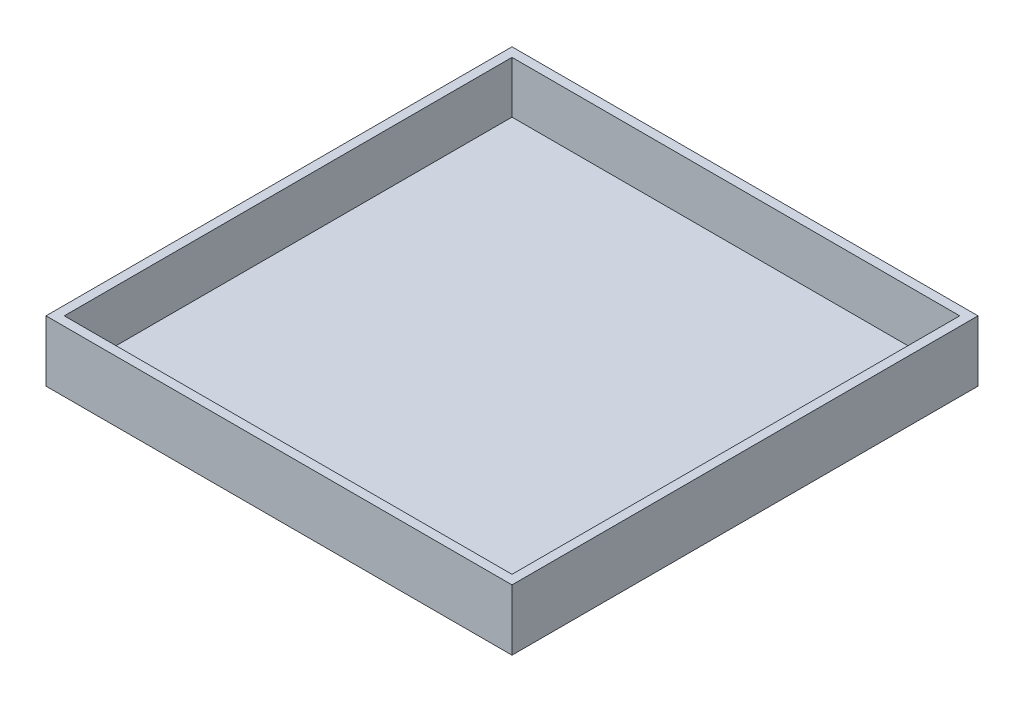
ISO-10303-21;
HEADER;
FILE_DESCRIPTION(('STEP AP214'),'2;1');
FILE_NAME('part.step','',(''),(''),'','','');
FILE_SCHEMA(('AUTOMOTIVE_DESIGN { 1 0 10303 214 1 1 1 1 }'));
ENDSEC;
DATA;
#1=APPLICATION_CONTEXT('core data for automotive mechanical design processes');
#2=APPLICATION_PROTOCOL_DEFINITION('international standard','automotive_design',2000,#1);
#3=PRODUCT_CONTEXT('',#1,'mechanical');
#4=PRODUCT('Part','Part','',(#3));
#5=PRODUCT_RELATED_PRODUCT_CATEGORY('part','',(#4));
#6=PRODUCT_DEFINITION_FORMATION('','',#4);
#7=PRODUCT_DEFINITION_CONTEXT('part definition',#1,'design');
#8=PRODUCT_DEFINITION('design','',#6,#7);
#9=PRODUCT_DEFINITION_SHAPE('','',#8);
#10=(LENGTH_UNIT() NAMED_UNIT(*) SI_UNIT(.MILLI.,.METRE.));
#11=(NAMED_UNIT(*) PLANE_ANGLE_UNIT() SI_UNIT($,.RADIAN.));
#12=(NAMED_UNIT(*) SI_UNIT($,.STERADIAN.) SOLID_ANGLE_UNIT());
#13=UNCERTAINTY_MEASURE_WITH_UNIT(LENGTH_MEASURE(1.E-05),#10,'distance_accuracy_value','');
#14=(GEOMETRIC_REPRESENTATION_CONTEXT(3) GLOBAL_UNCERTAINTY_ASSIGNED_CONTEXT((#13)) GLOBAL_UNIT_ASSIGNED_CONTEXT((#10,
#11,#12)) REPRESENTATION_CONTEXT('',''));
#15=CARTESIAN_POINT('',(0.,0.,0.));
#16=DIRECTION('',(0.,0.,1.));
#17=DIRECTION('',(1.,0.,0.));
#18=AXIS2_PLACEMENT_3D('',#15,#16,#17);
#19=CARTESIAN_POINT('',(76.4999999999999,20.,-76.5000000000001));
#20=DIRECTION('',(-1.,0.,0.));
#21=DIRECTION('',(0.,0.,1.));
#22=AXIS2_PLACEMENT_3D('',#19,#20,#21);
#23=PLANE('',#22);
#24=DIRECTION('',(0.,0.,-1.));
#25=VECTOR('',#24,1.);
#26=CARTESIAN_POINT('',(76.4999999999999,0.,-76.5000000000001));
#27=LINE('',#26,#25);
#28=CARTESIAN_POINT('',(76.5,0.,76.4999999999999));
#29=VERTEX_POINT('',#28);
#30=CARTESIAN_POINT('',(76.4999999999999,0.,-76.5000000000001));
#31=VERTEX_POINT('',#30);
#32=EDGE_CURVE('E171',#29,#31,#27,.T.);
#33=ORIENTED_EDGE('',*,*,#32,.T.);
#34=DIRECTION('',(0.,-1.,0.));
#35=VECTOR('',#34,1.);
#36=CARTESIAN_POINT('',(76.4999999999999,20.,-76.5000000000001));
#37=LINE('',#36,#35);
#38=CARTESIAN_POINT('',(76.4999999999999,20.,-76.5000000000001));
#39=VERTEX_POINT('',#38);
#40=EDGE_CURVE('E11',#39,#31,#37,.T.);
#41=ORIENTED_EDGE('',*,*,#40,.F.);
#42=DIRECTION('',(0.,0.,-1.));
#43=VECTOR('',#42,1.);
#44=CARTESIAN_POINT('',(76.4999999999999,20.,-76.5000000000001));
#45=LINE('',#44,#43);
#46=CARTESIAN_POINT('',(76.5,20.,76.4999999999999));
#47=VERTEX_POINT('',#46);
#48=EDGE_CURVE('E160',#47,#39,#45,.T.);
#49=ORIENTED_EDGE('',*,*,#48,.F.);
#50=DIRECTION('',(0.,-1.,0.));
#51=VECTOR('',#50,1.);
#52=CARTESIAN_POINT('',(76.5,20.,76.4999999999999));
#53=LINE('',#52,#51);
#54=EDGE_CURVE('E170',#47,#29,#53,.T.);
#55=ORIENTED_EDGE('',*,*,#54,.T.);
#56=EDGE_LOOP('',(#33,#41,#49,#55));
#57=FACE_BOUND('',#56,.T.);
#58=ADVANCED_FACE('F43',(#57),#23,.F.);
#59=CARTESIAN_POINT('',(-76.5000000000001,20.,-76.5000000000001));
#60=DIRECTION('',(0.,0.,1.));
#61=DIRECTION('',(1.,0.,0.));
#62=AXIS2_PLACEMENT_3D('',#59,#60,#61);
#63=PLANE('',#62);
#64=DIRECTION('',(-1.,0.,0.));
#65=VECTOR('',#64,1.);
#66=CARTESIAN_POINT('',(-76.5000000000001,0.,-76.5000000000001));
#67=LINE('',#66,#65);
#68=CARTESIAN_POINT('',(-76.5000000000001,0.,-76.5000000000001));
#69=VERTEX_POINT('',#68);
#70=EDGE_CURVE('E175',#31,#69,#67,.T.);
#71=ORIENTED_EDGE('',*,*,#70,.T.);
#72=DIRECTION('',(0.,-1.,0.));
#73=VECTOR('',#72,1.);
#74=CARTESIAN_POINT('',(-76.5000000000001,20.,-76.5000000000001));
#75=LINE('',#74,#73);
#76=CARTESIAN_POINT('',(-76.5000000000001,20.,-76.5000000000001));
#77=VERTEX_POINT('',#76);
#78=EDGE_CURVE('E51',#77,#69,#75,.T.);
#79=ORIENTED_EDGE('',*,*,#78,.F.);
#80=DIRECTION('',(-1.,0.,0.));
#81=VECTOR('',#80,1.);
#82=CARTESIAN_POINT('',(-76.5000000000001,20.,-76.5000000000001));
#83=LINE('',#82,#81);
#84=EDGE_CURVE('E95',#39,#77,#83,.T.);
#85=ORIENTED_EDGE('',*,*,#84,.F.);
#86=ORIENTED_EDGE('',*,*,#40,.T.);
#87=EDGE_LOOP('',(#71,#79,#85,#86));
#88=FACE_BOUND('',#87,.T.);
#89=ADVANCED_FACE('F210',(#88),#63,.F.);
#90=CARTESIAN_POINT('',(-76.5000000000001,20.,-76.5000000000001));
#91=DIRECTION('',(1.,0.,0.));
#92=DIRECTION('',(0.,0.,-1.));
#93=AXIS2_PLACEMENT_3D('',#90,#91,#92);
#94=PLANE('',#93);
#95=DIRECTION('',(0.,0.,1.));
#96=VECTOR('',#95,1.);
#97=CARTESIAN_POINT('',(-76.5000000000001,0.,-76.5000000000001));
#98=LINE('',#97,#96);
#99=CARTESIAN_POINT('',(-76.5,0.,76.4999999999999));
#100=VERTEX_POINT('',#99);
#101=EDGE_CURVE('E178',#69,#100,#98,.T.);
#102=ORIENTED_EDGE('',*,*,#101,.T.);
#103=DIRECTION('',(0.,-1.,0.));
#104=VECTOR('',#103,1.);
#105=CARTESIAN_POINT('',(-76.5,20.,76.4999999999999));
#106=LINE('',#105,#104);
#107=CARTESIAN_POINT('',(-76.5,20.,76.4999999999999));
#108=VERTEX_POINT('',#107);
#109=EDGE_CURVE('E185',#108,#100,#106,.T.);
#110=ORIENTED_EDGE('',*,*,#109,.F.);
#111=DIRECTION('',(0.,0.,1.));
#112=VECTOR('',#111,1.);
#113=CARTESIAN_POINT('',(-76.5000000000001,20.,-76.5000000000001));
#114=LINE('',#113,#112);
#115=EDGE_CURVE('E165',#77,#108,#114,.T.);
#116=ORIENTED_EDGE('',*,*,#115,.F.);
#117=ORIENTED_EDGE('',*,*,#78,.T.);
#118=EDGE_LOOP('',(#102,#110,#116,#117));
#119=FACE_BOUND('',#118,.T.);
#120=ADVANCED_FACE('F192',(#119),#94,.F.);
#121=CARTESIAN_POINT('',(-76.5,20.,76.4999999999999));
#122=DIRECTION('',(0.,0.,-1.));
#123=DIRECTION('',(-1.,0.,0.));
#124=AXIS2_PLACEMENT_3D('',#121,#122,#123);
#125=PLANE('',#124);
#126=DIRECTION('',(1.,0.,0.));
#127=VECTOR('',#126,1.);
#128=CARTESIAN_POINT('',(-76.5,0.,76.4999999999999));
#129=LINE('',#128,#127);
#130=EDGE_CURVE('E88',#100,#29,#129,.T.);
#131=ORIENTED_EDGE('',*,*,#130,.T.);
#132=ORIENTED_EDGE('',*,*,#54,.F.);
#133=DIRECTION('',(1.,0.,0.));
#134=VECTOR('',#133,1.);
#135=CARTESIAN_POINT('',(-76.5,20.,76.4999999999999));
#136=LINE('',#135,#134);
#137=EDGE_CURVE('E67',#108,#47,#136,.T.);
#138=ORIENTED_EDGE('',*,*,#137,.F.);
#139=ORIENTED_EDGE('',*,*,#109,.T.);
#140=EDGE_LOOP('',(#131,#132,#138,#139));
#141=FACE_BOUND('',#140,.T.);
#142=ADVANCED_FACE('F200',(#141),#125,.F.);
#143=CARTESIAN_POINT('',(0.,20.,0.));
#144=DIRECTION('',(0.,1.,0.));
#145=DIRECTION('',(0.,0.,1.));
#146=AXIS2_PLACEMENT_3D('',#143,#144,#145);
#147=PLANE('',#146);
#148=DIRECTION('',(0.,0.,-1.));
#149=VECTOR('',#148,1.);
#150=CARTESIAN_POINT('',(73.4999999999999,20.,-76.5000000000001));
#151=LINE('',#150,#149);
#152=CARTESIAN_POINT('',(73.5,20.,73.4999999999999));
#153=VERTEX_POINT('',#152);
#154=CARTESIAN_POINT('',(73.4999999999999,20.,-73.5000000000001));
#155=VERTEX_POINT('',#154);
#156=EDGE_CURVE('E144',#153,#155,#151,.T.);
#157=ORIENTED_EDGE('',*,*,#156,.F.);
#158=DIRECTION('',(1.,0.,0.));
#159=VECTOR('',#158,1.);
#160=CARTESIAN_POINT('',(-76.5,20.,73.4999999999999));
#161=LINE('',#160,#159);
#162=CARTESIAN_POINT('',(-73.5,20.,73.4999999999999));
#163=VERTEX_POINT('',#162);
#164=EDGE_CURVE('E157',#163,#153,#161,.T.);
#165=ORIENTED_EDGE('',*,*,#164,.F.);
#166=DIRECTION('',(0.,0.,1.));
#167=VECTOR('',#166,1.);
#168=CARTESIAN_POINT('',(-73.5000000000001,20.,-76.5000000000001));
#169=LINE('',#168,#167);
#170=CARTESIAN_POINT('',(-73.5000000000001,20.,-73.5000000000001));
#171=VERTEX_POINT('',#170);
#172=EDGE_CURVE('E154',#171,#163,#169,.T.);
#173=ORIENTED_EDGE('',*,*,#172,.F.);
#174=DIRECTION('',(-1.,0.,0.));
#175=VECTOR('',#174,1.);
#176=CARTESIAN_POINT('',(-76.5000000000001,20.,-73.5000000000001));
#177=LINE('',#176,#175);
#178=EDGE_CURVE('E133',#155,#171,#177,.T.);
#179=ORIENTED_EDGE('',*,*,#178,.F.);
#180=EDGE_LOOP('',(#157,#165,#173,#179));
#181=FACE_BOUND('',#180,.T.);
#182=ORIENTED_EDGE('',*,*,#48,.T.);
#183=ORIENTED_EDGE('',*,*,#84,.T.);
#184=ORIENTED_EDGE('',*,*,#115,.T.);
#185=ORIENTED_EDGE('',*,*,#137,.T.);
#186=EDGE_LOOP('',(#182,#183,#184,#185));
#187=FACE_BOUND('',#186,.T.);
#188=ADVANCED_FACE('F202',(#181,#187),#147,.T.);
#189=CARTESIAN_POINT('',(0.,0.,0.));
#190=DIRECTION('',(0.,1.,0.));
#191=DIRECTION('',(0.,0.,1.));
#192=AXIS2_PLACEMENT_3D('',#189,#190,#191);
#193=PLANE('',#192);
#194=ORIENTED_EDGE('',*,*,#32,.F.);
#195=ORIENTED_EDGE('',*,*,#130,.F.);
#196=ORIENTED_EDGE('',*,*,#101,.F.);
#197=ORIENTED_EDGE('',*,*,#70,.F.);
#198=EDGE_LOOP('',(#194,#195,#196,#197));
#199=FACE_BOUND('',#198,.T.);
#200=ADVANCED_FACE('F196',(#199),#193,.F.);
#201=CARTESIAN_POINT('',(73.4999999999999,20.,-76.5000000000001));
#202=DIRECTION('',(-1.,0.,0.));
#203=DIRECTION('',(0.,0.,1.));
#204=AXIS2_PLACEMENT_3D('',#201,#202,#203);
#205=PLANE('',#204);
#206=DIRECTION('',(0.,0.,-1.));
#207=VECTOR('',#206,1.);
#208=CARTESIAN_POINT('',(73.4999999999999,3.,-76.5000000000001));
#209=LINE('',#208,#207);
#210=CARTESIAN_POINT('',(73.5,3.,73.4999999999999));
#211=VERTEX_POINT('',#210);
#212=CARTESIAN_POINT('',(73.4999999999999,3.,-73.5000000000001));
#213=VERTEX_POINT('',#212);
#214=EDGE_CURVE('E123',#211,#213,#209,.T.);
#215=ORIENTED_EDGE('',*,*,#214,.F.);
#216=DIRECTION('',(0.,-1.,0.));
#217=VECTOR('',#216,1.);
#218=CARTESIAN_POINT('',(73.5,20.,73.4999999999999));
#219=LINE('',#218,#217);
#220=EDGE_CURVE('E148',#153,#211,#219,.T.);
#221=ORIENTED_EDGE('',*,*,#220,.F.);
#222=ORIENTED_EDGE('',*,*,#156,.T.);
#223=DIRECTION('',(0.,-1.,0.));
#224=VECTOR('',#223,1.);
#225=CARTESIAN_POINT('',(73.4999999999999,20.,-73.5000000000001));
#226=LINE('',#225,#224);
#227=EDGE_CURVE('E137',#155,#213,#226,.T.);
#228=ORIENTED_EDGE('',*,*,#227,.T.);
#229=EDGE_LOOP('',(#215,#221,#222,#228));
#230=FACE_BOUND('',#229,.T.);
#231=ADVANCED_FACE('F239',(#230),#205,.T.);
#232=CARTESIAN_POINT('',(-76.5000000000001,20.,-73.5000000000001));
#233=DIRECTION('',(0.,0.,1.));
#234=DIRECTION('',(1.,0.,0.));
#235=AXIS2_PLACEMENT_3D('',#232,#233,#234);
#236=PLANE('',#235);
#237=DIRECTION('',(-1.,0.,0.));
#238=VECTOR('',#237,1.);
#239=CARTESIAN_POINT('',(-76.5000000000001,3.,-73.5000000000001));
#240=LINE('',#239,#238);
#241=CARTESIAN_POINT('',(-73.5000000000001,3.,-73.5000000000001));
#242=VERTEX_POINT('',#241);
#243=EDGE_CURVE('E117',#213,#242,#240,.T.);
#244=ORIENTED_EDGE('',*,*,#243,.F.);
#245=ORIENTED_EDGE('',*,*,#227,.F.);
#246=ORIENTED_EDGE('',*,*,#178,.T.);
#247=DIRECTION('',(0.,-1.,0.));
#248=VECTOR('',#247,1.);
#249=CARTESIAN_POINT('',(-73.5000000000001,20.,-73.5000000000001));
#250=LINE('',#249,#248);
#251=EDGE_CURVE('E130',#171,#242,#250,.T.);
#252=ORIENTED_EDGE('',*,*,#251,.T.);
#253=EDGE_LOOP('',(#244,#245,#246,#252));
#254=FACE_BOUND('',#253,.T.);
#255=ADVANCED_FACE('F131',(#254),#236,.T.);
#256=CARTESIAN_POINT('',(-73.5000000000001,20.,-76.5000000000001));
#257=DIRECTION('',(1.,0.,0.));
#258=DIRECTION('',(0.,0.,-1.));
#259=AXIS2_PLACEMENT_3D('',#256,#257,#258);
#260=PLANE('',#259);
#261=DIRECTION('',(0.,0.,1.));
#262=VECTOR('',#261,1.);
#263=CARTESIAN_POINT('',(-73.5000000000001,3.,-76.5000000000001));
#264=LINE('',#263,#262);
#265=CARTESIAN_POINT('',(-73.5,3.,73.4999999999999));
#266=VERTEX_POINT('',#265);
#267=EDGE_CURVE('E121',#242,#266,#264,.T.);
#268=ORIENTED_EDGE('',*,*,#267,.F.);
#269=ORIENTED_EDGE('',*,*,#251,.F.);
#270=ORIENTED_EDGE('',*,*,#172,.T.);
#271=DIRECTION('',(0.,-1.,0.));
#272=VECTOR('',#271,1.);
#273=CARTESIAN_POINT('',(-73.5,20.,73.4999999999999));
#274=LINE('',#273,#272);
#275=EDGE_CURVE('E58',#163,#266,#274,.T.);
#276=ORIENTED_EDGE('',*,*,#275,.T.);
#277=EDGE_LOOP('',(#268,#269,#270,#276));
#278=FACE_BOUND('',#277,.T.);
#279=ADVANCED_FACE('F139',(#278),#260,.T.);
#280=CARTESIAN_POINT('',(-76.5,20.,73.4999999999999));
#281=DIRECTION('',(0.,0.,-1.));
#282=DIRECTION('',(-1.,0.,0.));
#283=AXIS2_PLACEMENT_3D('',#280,#281,#282);
#284=PLANE('',#283);
#285=DIRECTION('',(1.,0.,0.));
#286=VECTOR('',#285,1.);
#287=CARTESIAN_POINT('',(-76.5,3.,73.4999999999999));
#288=LINE('',#287,#286);
#289=EDGE_CURVE('E141',#266,#211,#288,.T.);
#290=ORIENTED_EDGE('',*,*,#289,.F.);
#291=ORIENTED_EDGE('',*,*,#275,.F.);
#292=ORIENTED_EDGE('',*,*,#164,.T.);
#293=ORIENTED_EDGE('',*,*,#220,.T.);
#294=EDGE_LOOP('',(#290,#291,#292,#293));
#295=FACE_BOUND('',#294,.T.);
#296=ADVANCED_FACE('F273',(#295),#284,.T.);
#297=CARTESIAN_POINT('',(0.,3.,0.));
#298=DIRECTION('',(0.,1.,0.));
#299=DIRECTION('',(0.,0.,1.));
#300=AXIS2_PLACEMENT_3D('',#297,#298,#299);
#301=PLANE('',#300);
#302=ORIENTED_EDGE('',*,*,#214,.T.);
#303=ORIENTED_EDGE('',*,*,#243,.T.);
#304=ORIENTED_EDGE('',*,*,#267,.T.);
#305=ORIENTED_EDGE('',*,*,#289,.T.);
#306=EDGE_LOOP('',(#302,#303,#304,#305));
#307=FACE_BOUND('',#306,.T.);
#308=ADVANCED_FACE('F119',(#307),#301,.T.);
#309=CLOSED_SHELL('',(#58,#89,#120,#142,#188,#200,#231,#255,#279,#296,#308));
#310=MANIFOLD_SOLID_BREP('B2',#309);
#311=ADVANCED_BREP_SHAPE_REPRESENTATION('',(#18,#310),#14);
#312=SHAPE_DEFINITION_REPRESENTATION(#9,#311);
ENDSEC;
END-ISO-10303-21;
